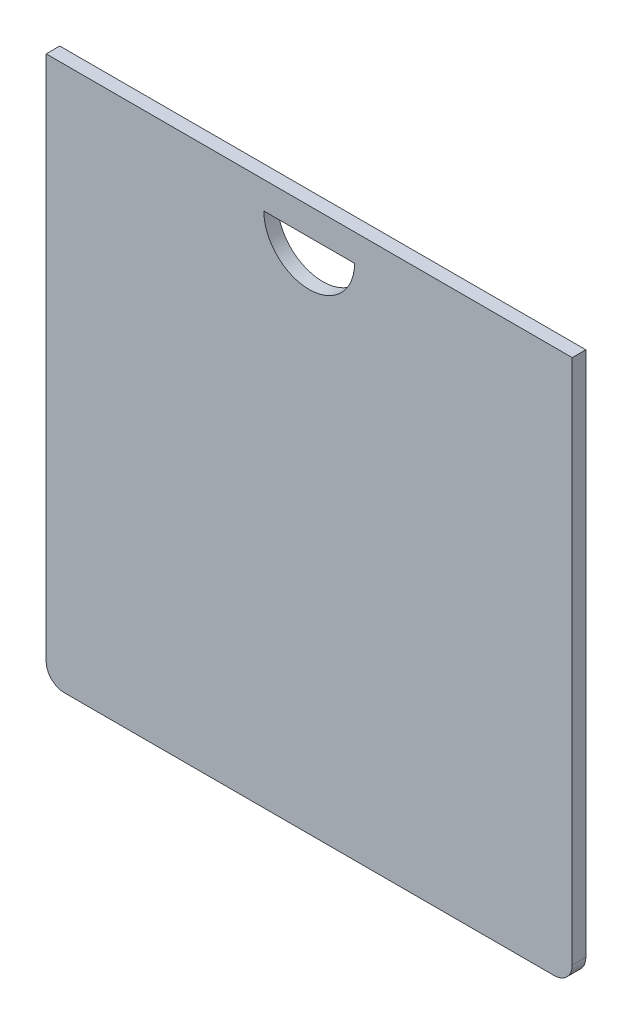
ISO-10303-21;
HEADER;
FILE_DESCRIPTION(('STEP AP214'),'2;1');
FILE_NAME('part.step','',(''),(''),'','','');
FILE_SCHEMA(('AUTOMOTIVE_DESIGN { 1 0 10303 214 1 1 1 1 }'));
ENDSEC;
DATA;
#1=APPLICATION_CONTEXT('core data for automotive mechanical design processes');
#2=APPLICATION_PROTOCOL_DEFINITION('international standard','automotive_design',2000,#1);
#3=PRODUCT_CONTEXT('',#1,'mechanical');
#4=PRODUCT('Part','Part','',(#3));
#5=PRODUCT_RELATED_PRODUCT_CATEGORY('part','',(#4));
#6=PRODUCT_DEFINITION_FORMATION('','',#4);
#7=PRODUCT_DEFINITION_CONTEXT('part definition',#1,'design');
#8=PRODUCT_DEFINITION('design','',#6,#7);
#9=PRODUCT_DEFINITION_SHAPE('','',#8);
#10=(LENGTH_UNIT() NAMED_UNIT(*) SI_UNIT(.MILLI.,.METRE.));
#11=(NAMED_UNIT(*) PLANE_ANGLE_UNIT() SI_UNIT($,.RADIAN.));
#12=(NAMED_UNIT(*) SI_UNIT($,.STERADIAN.) SOLID_ANGLE_UNIT());
#13=UNCERTAINTY_MEASURE_WITH_UNIT(LENGTH_MEASURE(1.E-05),#10,'distance_accuracy_value','');
#14=(GEOMETRIC_REPRESENTATION_CONTEXT(3) GLOBAL_UNCERTAINTY_ASSIGNED_CONTEXT((#13)) GLOBAL_UNIT_ASSIGNED_CONTEXT((#10,
#11,#12)) REPRESENTATION_CONTEXT('',''));
#15=CARTESIAN_POINT('',(0.,0.,0.));
#16=DIRECTION('',(0.,0.,1.));
#17=DIRECTION('',(1.,0.,0.));
#18=AXIS2_PLACEMENT_3D('',#15,#16,#17);
#19=CARTESIAN_POINT('',(0.,60.,1.5));
#20=DIRECTION('',(1.,0.,0.));
#21=DIRECTION('',(0.,1.,0.));
#22=AXIS2_PLACEMENT_3D('',#19,#20,#21);
#23=PLANE('',#22);
#24=DIRECTION('',(0.,-1.,0.));
#25=VECTOR('',#24,1.);
#26=CARTESIAN_POINT('',(0.,60.,0.));
#27=LINE('',#26,#25);
#28=CARTESIAN_POINT('',(0.,60.,0.));
#29=VERTEX_POINT('',#28);
#30=CARTESIAN_POINT('',(0.,2.,0.));
#31=VERTEX_POINT('',#30);
#32=EDGE_CURVE('E113',#29,#31,#27,.T.);
#33=ORIENTED_EDGE('',*,*,#32,.T.);
#34=DIRECTION('',(0.,0.,-1.));
#35=VECTOR('',#34,1.);
#36=CARTESIAN_POINT('',(0.,2.,1.5));
#37=LINE('',#36,#35);
#38=CARTESIAN_POINT('',(0.,2.,1.5));
#39=VERTEX_POINT('',#38);
#40=EDGE_CURVE('E11',#31,#39,#37,.F.);
#41=ORIENTED_EDGE('',*,*,#40,.T.);
#42=DIRECTION('',(0.,-1.,0.));
#43=VECTOR('',#42,1.);
#44=CARTESIAN_POINT('',(0.,60.,1.5));
#45=LINE('',#44,#43);
#46=CARTESIAN_POINT('',(0.,60.,1.5));
#47=VERTEX_POINT('',#46);
#48=EDGE_CURVE('E115',#47,#39,#45,.T.);
#49=ORIENTED_EDGE('',*,*,#48,.F.);
#50=DIRECTION('',(0.,0.,-1.));
#51=VECTOR('',#50,1.);
#52=CARTESIAN_POINT('',(0.,60.,1.5));
#53=LINE('',#52,#51);
#54=EDGE_CURVE('E126',#47,#29,#53,.T.);
#55=ORIENTED_EDGE('',*,*,#54,.T.);
#56=EDGE_LOOP('',(#33,#41,#49,#55));
#57=FACE_BOUND('',#56,.T.);
#58=ADVANCED_FACE('F33',(#57),#23,.F.);
#59=CARTESIAN_POINT('',(0.,0.,1.5));
#60=DIRECTION('',(0.,1.,0.));
#61=DIRECTION('',(0.,0.,1.));
#62=AXIS2_PLACEMENT_3D('',#59,#60,#61);
#63=PLANE('',#62);
#64=DIRECTION('',(1.,0.,0.));
#65=VECTOR('',#64,1.);
#66=CARTESIAN_POINT('',(0.,0.,0.));
#67=LINE('',#66,#65);
#68=CARTESIAN_POINT('',(2.,0.,0.));
#69=VERTEX_POINT('',#68);
#70=CARTESIAN_POINT('',(56.,0.,0.));
#71=VERTEX_POINT('',#70);
#72=EDGE_CURVE('E129',#69,#71,#67,.T.);
#73=ORIENTED_EDGE('',*,*,#72,.T.);
#74=DIRECTION('',(0.,0.,-1.));
#75=VECTOR('',#74,1.);
#76=CARTESIAN_POINT('',(56.,0.,1.5));
#77=LINE('',#76,#75);
#78=CARTESIAN_POINT('',(56.,0.,1.5));
#79=VERTEX_POINT('',#78);
#80=EDGE_CURVE('E150',#71,#79,#77,.F.);
#81=ORIENTED_EDGE('',*,*,#80,.T.);
#82=DIRECTION('',(1.,0.,0.));
#83=VECTOR('',#82,1.);
#84=CARTESIAN_POINT('',(0.,0.,1.5));
#85=LINE('',#84,#83);
#86=CARTESIAN_POINT('',(2.,0.,1.5));
#87=VERTEX_POINT('',#86);
#88=EDGE_CURVE('E118',#87,#79,#85,.T.);
#89=ORIENTED_EDGE('',*,*,#88,.F.);
#90=DIRECTION('',(0.,0.,-1.));
#91=VECTOR('',#90,1.);
#92=CARTESIAN_POINT('',(2.,0.,1.5));
#93=LINE('',#92,#91);
#94=EDGE_CURVE('E147',#87,#69,#93,.T.);
#95=ORIENTED_EDGE('',*,*,#94,.T.);
#96=EDGE_LOOP('',(#73,#81,#89,#95));
#97=FACE_BOUND('',#96,.T.);
#98=ADVANCED_FACE('F170',(#97),#63,.F.);
#99=CARTESIAN_POINT('',(58.,60.,1.5));
#100=DIRECTION('',(-1.,0.,0.));
#101=DIRECTION('',(0.,-1.,0.));
#102=AXIS2_PLACEMENT_3D('',#99,#100,#101);
#103=PLANE('',#102);
#104=DIRECTION('',(0.,1.,0.));
#105=VECTOR('',#104,1.);
#106=CARTESIAN_POINT('',(58.,60.,1.5));
#107=LINE('',#106,#105);
#108=CARTESIAN_POINT('',(58.,2.,1.5));
#109=VERTEX_POINT('',#108);
#110=CARTESIAN_POINT('',(58.,60.,1.5));
#111=VERTEX_POINT('',#110);
#112=EDGE_CURVE('E122',#109,#111,#107,.T.);
#113=ORIENTED_EDGE('',*,*,#112,.F.);
#114=DIRECTION('',(0.,0.,-1.));
#115=VECTOR('',#114,1.);
#116=CARTESIAN_POINT('',(58.,2.,1.5));
#117=LINE('',#116,#115);
#118=CARTESIAN_POINT('',(58.,2.,0.));
#119=VERTEX_POINT('',#118);
#120=EDGE_CURVE('E140',#109,#119,#117,.T.);
#121=ORIENTED_EDGE('',*,*,#120,.T.);
#122=DIRECTION('',(0.,1.,0.));
#123=VECTOR('',#122,1.);
#124=CARTESIAN_POINT('',(58.,60.,0.));
#125=LINE('',#124,#123);
#126=CARTESIAN_POINT('',(58.,60.,0.));
#127=VERTEX_POINT('',#126);
#128=EDGE_CURVE('E132',#119,#127,#125,.T.);
#129=ORIENTED_EDGE('',*,*,#128,.T.);
#130=DIRECTION('',(0.,0.,-1.));
#131=VECTOR('',#130,1.);
#132=CARTESIAN_POINT('',(58.,60.,1.5));
#133=LINE('',#132,#131);
#134=EDGE_CURVE('E137',#111,#127,#133,.T.);
#135=ORIENTED_EDGE('',*,*,#134,.F.);
#136=EDGE_LOOP('',(#113,#121,#129,#135));
#137=FACE_BOUND('',#136,.T.);
#138=ADVANCED_FACE('F163',(#137),#103,.F.);
#139=CARTESIAN_POINT('',(0.,60.,1.5));
#140=DIRECTION('',(0.,-1.,0.));
#141=DIRECTION('',(0.,0.,-1.));
#142=AXIS2_PLACEMENT_3D('',#139,#140,#141);
#143=PLANE('',#142);
#144=DIRECTION('',(-1.,0.,0.));
#145=VECTOR('',#144,1.);
#146=CARTESIAN_POINT('',(0.,60.,0.));
#147=LINE('',#146,#145);
#148=EDGE_CURVE('E119',#127,#29,#147,.T.);
#149=ORIENTED_EDGE('',*,*,#148,.T.);
#150=ORIENTED_EDGE('',*,*,#54,.F.);
#151=DIRECTION('',(-1.,0.,0.));
#152=VECTOR('',#151,1.);
#153=CARTESIAN_POINT('',(0.,60.,1.5));
#154=LINE('',#153,#152);
#155=EDGE_CURVE('E124',#111,#47,#154,.T.);
#156=ORIENTED_EDGE('',*,*,#155,.F.);
#157=ORIENTED_EDGE('',*,*,#134,.T.);
#158=EDGE_LOOP('',(#149,#150,#156,#157));
#159=FACE_BOUND('',#158,.T.);
#160=ADVANCED_FACE('F180',(#159),#143,.F.);
#161=CARTESIAN_POINT('',(0.,0.,1.5));
#162=DIRECTION('',(0.,0.,1.));
#163=DIRECTION('',(1.,0.,0.));
#164=AXIS2_PLACEMENT_3D('',#161,#162,#163);
#165=PLANE('',#164);
#166=CARTESIAN_POINT('',(29.,57.,1.5));
#167=DIRECTION('',(0.,0.,1.));
#168=DIRECTION('',(1.,0.,0.));
#169=AXIS2_PLACEMENT_3D('',#166,#167,#168);
#170=CIRCLE('',#169,5.);
#171=CARTESIAN_POINT('',(24.,57.,1.5));
#172=VERTEX_POINT('',#171);
#173=CARTESIAN_POINT('',(34.,57.,1.5));
#174=VERTEX_POINT('',#173);
#175=EDGE_CURVE('E48',#172,#174,#170,.T.);
#176=ORIENTED_EDGE('',*,*,#175,.F.);
#177=DIRECTION('',(-1.,0.,0.));
#178=VECTOR('',#177,1.);
#179=CARTESIAN_POINT('',(24.,57.,1.5));
#180=LINE('',#179,#178);
#181=EDGE_CURVE('E108',#174,#172,#180,.T.);
#182=ORIENTED_EDGE('',*,*,#181,.F.);
#183=EDGE_LOOP('',(#176,#182));
#184=FACE_BOUND('',#183,.T.);
#185=ORIENTED_EDGE('',*,*,#88,.T.);
#186=CARTESIAN_POINT('',(56.,2.,1.5));
#187=DIRECTION('',(0.,0.,1.));
#188=DIRECTION('',(1.,0.,0.));
#189=AXIS2_PLACEMENT_3D('',#186,#187,#188);
#190=CIRCLE('',#189,2.);
#191=EDGE_CURVE('E41',#79,#109,#190,.T.);
#192=ORIENTED_EDGE('',*,*,#191,.T.);
#193=ORIENTED_EDGE('',*,*,#112,.T.);
#194=ORIENTED_EDGE('',*,*,#155,.T.);
#195=ORIENTED_EDGE('',*,*,#48,.T.);
#196=CARTESIAN_POINT('',(2.,2.,1.5));
#197=DIRECTION('',(0.,0.,1.));
#198=DIRECTION('',(1.,0.,0.));
#199=AXIS2_PLACEMENT_3D('',#196,#197,#198);
#200=CIRCLE('',#199,2.);
#201=EDGE_CURVE('E152',#39,#87,#200,.T.);
#202=ORIENTED_EDGE('',*,*,#201,.T.);
#203=EDGE_LOOP('',(#185,#192,#193,#194,#195,#202));
#204=FACE_BOUND('',#203,.T.);
#205=ADVANCED_FACE('F156',(#184,#204),#165,.T.);
#206=CARTESIAN_POINT('',(0.,0.,0.));
#207=DIRECTION('',(0.,0.,1.));
#208=DIRECTION('',(1.,0.,0.));
#209=AXIS2_PLACEMENT_3D('',#206,#207,#208);
#210=PLANE('',#209);
#211=DIRECTION('',(-1.,0.,0.));
#212=VECTOR('',#211,1.);
#213=CARTESIAN_POINT('',(24.,57.,0.));
#214=LINE('',#213,#212);
#215=CARTESIAN_POINT('',(34.,57.,0.));
#216=VERTEX_POINT('',#215);
#217=CARTESIAN_POINT('',(24.,57.,0.));
#218=VERTEX_POINT('',#217);
#219=EDGE_CURVE('E100',#216,#218,#214,.T.);
#220=ORIENTED_EDGE('',*,*,#219,.T.);
#221=CARTESIAN_POINT('',(29.,57.,0.));
#222=DIRECTION('',(0.,0.,1.));
#223=DIRECTION('',(1.,0.,0.));
#224=AXIS2_PLACEMENT_3D('',#221,#222,#223);
#225=CIRCLE('',#224,5.);
#226=EDGE_CURVE('E53',#218,#216,#225,.T.);
#227=ORIENTED_EDGE('',*,*,#226,.T.);
#228=EDGE_LOOP('',(#220,#227));
#229=FACE_BOUND('',#228,.T.);
#230=ORIENTED_EDGE('',*,*,#128,.F.);
#231=CARTESIAN_POINT('',(56.,2.,0.));
#232=DIRECTION('',(0.,0.,1.));
#233=DIRECTION('',(1.,0.,0.));
#234=AXIS2_PLACEMENT_3D('',#231,#232,#233);
#235=CIRCLE('',#234,2.);
#236=EDGE_CURVE('E145',#119,#71,#235,.F.);
#237=ORIENTED_EDGE('',*,*,#236,.T.);
#238=ORIENTED_EDGE('',*,*,#72,.F.);
#239=CARTESIAN_POINT('',(2.,2.,0.));
#240=DIRECTION('',(0.,0.,1.));
#241=DIRECTION('',(1.,0.,0.));
#242=AXIS2_PLACEMENT_3D('',#239,#240,#241);
#243=CIRCLE('',#242,2.);
#244=EDGE_CURVE('E143',#69,#31,#243,.F.);
#245=ORIENTED_EDGE('',*,*,#244,.T.);
#246=ORIENTED_EDGE('',*,*,#32,.F.);
#247=ORIENTED_EDGE('',*,*,#148,.F.);
#248=EDGE_LOOP('',(#230,#237,#238,#245,#246,#247));
#249=FACE_BOUND('',#248,.T.);
#250=ADVANCED_FACE('F106',(#229,#249),#210,.F.);
#251=CARTESIAN_POINT('',(56.,2.,1.5));
#252=DIRECTION('',(0.,0.,-1.));
#253=DIRECTION('',(-1.,0.,0.));
#254=AXIS2_PLACEMENT_3D('',#251,#252,#253);
#255=CYLINDRICAL_SURFACE('',#254,2.);
#256=ORIENTED_EDGE('',*,*,#191,.F.);
#257=ORIENTED_EDGE('',*,*,#80,.F.);
#258=ORIENTED_EDGE('',*,*,#236,.F.);
#259=ORIENTED_EDGE('',*,*,#120,.F.);
#260=EDGE_LOOP('',(#256,#257,#258,#259));
#261=FACE_BOUND('',#260,.T.);
#262=ADVANCED_FACE('F166',(#261),#255,.T.);
#263=CARTESIAN_POINT('',(2.,2.,1.5));
#264=DIRECTION('',(0.,0.,-1.));
#265=DIRECTION('',(-1.,0.,0.));
#266=AXIS2_PLACEMENT_3D('',#263,#264,#265);
#267=CYLINDRICAL_SURFACE('',#266,2.);
#268=ORIENTED_EDGE('',*,*,#201,.F.);
#269=ORIENTED_EDGE('',*,*,#40,.F.);
#270=ORIENTED_EDGE('',*,*,#244,.F.);
#271=ORIENTED_EDGE('',*,*,#94,.F.);
#272=EDGE_LOOP('',(#268,#269,#270,#271));
#273=FACE_BOUND('',#272,.T.);
#274=ADVANCED_FACE('F35',(#273),#267,.T.);
#275=CARTESIAN_POINT('',(29.,57.,0.));
#276=DIRECTION('',(0.,0.,1.));
#277=DIRECTION('',(1.,0.,0.));
#278=AXIS2_PLACEMENT_3D('',#275,#276,#277);
#279=CYLINDRICAL_SURFACE('',#278,5.);
#280=ORIENTED_EDGE('',*,*,#175,.T.);
#281=DIRECTION('',(0.,0.,1.));
#282=VECTOR('',#281,1.);
#283=CARTESIAN_POINT('',(34.,57.,0.));
#284=LINE('',#283,#282);
#285=EDGE_CURVE('E93',#216,#174,#284,.T.);
#286=ORIENTED_EDGE('',*,*,#285,.F.);
#287=ORIENTED_EDGE('',*,*,#226,.F.);
#288=DIRECTION('',(0.,0.,1.));
#289=VECTOR('',#288,1.);
#290=CARTESIAN_POINT('',(24.,57.,0.));
#291=LINE('',#290,#289);
#292=EDGE_CURVE('E99',#218,#172,#291,.T.);
#293=ORIENTED_EDGE('',*,*,#292,.T.);
#294=EDGE_LOOP('',(#280,#286,#287,#293));
#295=FACE_BOUND('',#294,.T.);
#296=ADVANCED_FACE('F95',(#295),#279,.F.);
#297=CARTESIAN_POINT('',(24.,57.,0.));
#298=DIRECTION('',(0.,1.,0.));
#299=DIRECTION('',(0.,0.,1.));
#300=AXIS2_PLACEMENT_3D('',#297,#298,#299);
#301=PLANE('',#300);
#302=ORIENTED_EDGE('',*,*,#181,.T.);
#303=ORIENTED_EDGE('',*,*,#292,.F.);
#304=ORIENTED_EDGE('',*,*,#219,.F.);
#305=ORIENTED_EDGE('',*,*,#285,.T.);
#306=EDGE_LOOP('',(#302,#303,#304,#305));
#307=FACE_BOUND('',#306,.T.);
#308=ADVANCED_FACE('F103',(#307),#301,.F.);
#309=CLOSED_SHELL('',(#58,#98,#138,#160,#205,#250,#262,#274,#296,#308));
#310=MANIFOLD_SOLID_BREP('B2',#309);
#311=ADVANCED_BREP_SHAPE_REPRESENTATION('',(#18,#310),#14);
#312=SHAPE_DEFINITION_REPRESENTATION(#9,#311);
ENDSEC;
END-ISO-10303-21;
